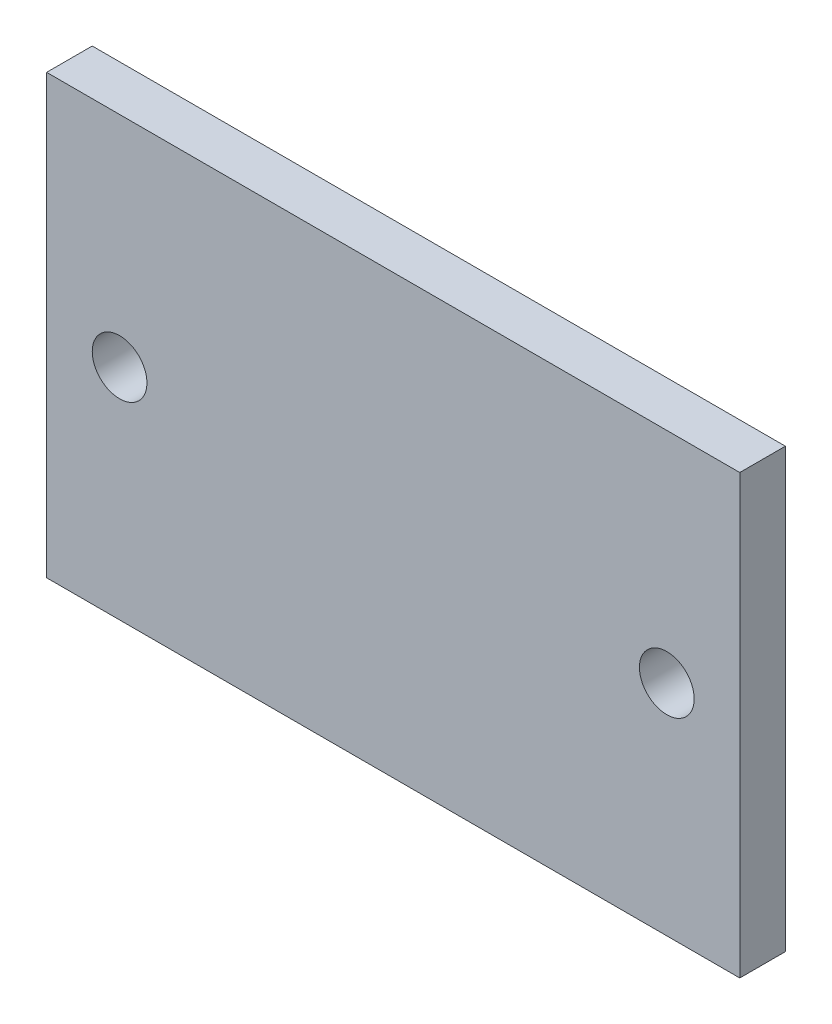
ISO-10303-21;
HEADER;
FILE_DESCRIPTION(('STEP AP214'),'2;1');
FILE_NAME('part.step','',(''),(''),'','','');
FILE_SCHEMA(('AUTOMOTIVE_DESIGN { 1 0 10303 214 1 1 1 1 }'));
ENDSEC;
DATA;
#1=APPLICATION_CONTEXT('core data for automotive mechanical design processes');
#2=APPLICATION_PROTOCOL_DEFINITION('international standard','automotive_design',2000,#1);
#3=PRODUCT_CONTEXT('',#1,'mechanical');
#4=PRODUCT('Part','Part','',(#3));
#5=PRODUCT_RELATED_PRODUCT_CATEGORY('part','',(#4));
#6=PRODUCT_DEFINITION_FORMATION('','',#4);
#7=PRODUCT_DEFINITION_CONTEXT('part definition',#1,'design');
#8=PRODUCT_DEFINITION('design','',#6,#7);
#9=PRODUCT_DEFINITION_SHAPE('','',#8);
#10=(LENGTH_UNIT() NAMED_UNIT(*) SI_UNIT(.MILLI.,.METRE.));
#11=(NAMED_UNIT(*) PLANE_ANGLE_UNIT() SI_UNIT($,.RADIAN.));
#12=(NAMED_UNIT(*) SI_UNIT($,.STERADIAN.) SOLID_ANGLE_UNIT());
#13=UNCERTAINTY_MEASURE_WITH_UNIT(LENGTH_MEASURE(1.E-05),#10,'distance_accuracy_value','');
#14=(GEOMETRIC_REPRESENTATION_CONTEXT(3) GLOBAL_UNCERTAINTY_ASSIGNED_CONTEXT((#13)) GLOBAL_UNIT_ASSIGNED_CONTEXT((#10,
#11,#12)) REPRESENTATION_CONTEXT('',''));
#15=CARTESIAN_POINT('',(0.,0.,0.));
#16=DIRECTION('',(0.,0.,1.));
#17=DIRECTION('',(1.,0.,0.));
#18=AXIS2_PLACEMENT_3D('',#15,#16,#17);
#19=CARTESIAN_POINT('',(0.,0.,3.175));
#20=DIRECTION('',(1.,0.,0.));
#21=DIRECTION('',(0.,0.,-1.));
#22=AXIS2_PLACEMENT_3D('',#19,#20,#21);
#23=PLANE('',#22);
#24=DIRECTION('',(0.,-1.,0.));
#25=VECTOR('',#24,1.);
#26=CARTESIAN_POINT('',(0.,0.,0.));
#27=LINE('',#26,#25);
#28=CARTESIAN_POINT('',(0.,30.48,0.));
#29=VERTEX_POINT('',#28);
#30=CARTESIAN_POINT('',(0.,0.,0.));
#31=VERTEX_POINT('',#30);
#32=EDGE_CURVE('E112',#29,#31,#27,.T.);
#33=ORIENTED_EDGE('',*,*,#32,.T.);
#34=DIRECTION('',(0.,0.,-1.));
#35=VECTOR('',#34,1.);
#36=CARTESIAN_POINT('',(0.,0.,3.175));
#37=LINE('',#36,#35);
#38=CARTESIAN_POINT('',(0.,0.,3.175));
#39=VERTEX_POINT('',#38);
#40=EDGE_CURVE('E11',#39,#31,#37,.T.);
#41=ORIENTED_EDGE('',*,*,#40,.F.);
#42=DIRECTION('',(0.,-1.,0.));
#43=VECTOR('',#42,1.);
#44=CARTESIAN_POINT('',(0.,0.,3.175));
#45=LINE('',#44,#43);
#46=CARTESIAN_POINT('',(0.,30.48,3.175));
#47=VERTEX_POINT('',#46);
#48=EDGE_CURVE('E96',#47,#39,#45,.T.);
#49=ORIENTED_EDGE('',*,*,#48,.F.);
#50=DIRECTION('',(0.,0.,-1.));
#51=VECTOR('',#50,1.);
#52=CARTESIAN_POINT('',(0.,30.48,3.175));
#53=LINE('',#52,#51);
#54=EDGE_CURVE('E108',#47,#29,#53,.T.);
#55=ORIENTED_EDGE('',*,*,#54,.T.);
#56=EDGE_LOOP('',(#33,#41,#49,#55));
#57=FACE_BOUND('',#56,.T.);
#58=ADVANCED_FACE('F44',(#57),#23,.F.);
#59=CARTESIAN_POINT('',(0.,0.,3.175));
#60=DIRECTION('',(0.,1.,0.));
#61=DIRECTION('',(0.,0.,1.));
#62=AXIS2_PLACEMENT_3D('',#59,#60,#61);
#63=PLANE('',#62);
#64=DIRECTION('',(1.,0.,0.));
#65=VECTOR('',#64,1.);
#66=CARTESIAN_POINT('',(0.,0.,0.));
#67=LINE('',#66,#65);
#68=CARTESIAN_POINT('',(48.26,0.,0.));
#69=VERTEX_POINT('',#68);
#70=EDGE_CURVE('E101',#31,#69,#67,.T.);
#71=ORIENTED_EDGE('',*,*,#70,.T.);
#72=DIRECTION('',(0.,0.,-1.));
#73=VECTOR('',#72,1.);
#74=CARTESIAN_POINT('',(48.26,0.,3.175));
#75=LINE('',#74,#73);
#76=CARTESIAN_POINT('',(48.26,0.,3.175));
#77=VERTEX_POINT('',#76);
#78=EDGE_CURVE('E53',#77,#69,#75,.T.);
#79=ORIENTED_EDGE('',*,*,#78,.F.);
#80=DIRECTION('',(1.,0.,0.));
#81=VECTOR('',#80,1.);
#82=CARTESIAN_POINT('',(0.,0.,3.175));
#83=LINE('',#82,#81);
#84=EDGE_CURVE('E91',#39,#77,#83,.T.);
#85=ORIENTED_EDGE('',*,*,#84,.F.);
#86=ORIENTED_EDGE('',*,*,#40,.T.);
#87=EDGE_LOOP('',(#71,#79,#85,#86));
#88=FACE_BOUND('',#87,.T.);
#89=ADVANCED_FACE('F100',(#88),#63,.F.);
#90=CARTESIAN_POINT('',(48.26,0.,3.175));
#91=DIRECTION('',(-1.,0.,0.));
#92=DIRECTION('',(0.,0.,1.));
#93=AXIS2_PLACEMENT_3D('',#90,#91,#92);
#94=PLANE('',#93);
#95=DIRECTION('',(0.,1.,0.));
#96=VECTOR('',#95,1.);
#97=CARTESIAN_POINT('',(48.26,0.,0.));
#98=LINE('',#97,#96);
#99=CARTESIAN_POINT('',(48.26,30.48,0.));
#100=VERTEX_POINT('',#99);
#101=EDGE_CURVE('E78',#69,#100,#98,.T.);
#102=ORIENTED_EDGE('',*,*,#101,.T.);
#103=DIRECTION('',(0.,0.,-1.));
#104=VECTOR('',#103,1.);
#105=CARTESIAN_POINT('',(48.26,30.48,3.175));
#106=LINE('',#105,#104);
#107=CARTESIAN_POINT('',(48.26,30.48,3.175));
#108=VERTEX_POINT('',#107);
#109=EDGE_CURVE('E103',#108,#100,#106,.T.);
#110=ORIENTED_EDGE('',*,*,#109,.F.);
#111=DIRECTION('',(0.,1.,0.));
#112=VECTOR('',#111,1.);
#113=CARTESIAN_POINT('',(48.26,0.,3.175));
#114=LINE('',#113,#112);
#115=EDGE_CURVE('E94',#77,#108,#114,.T.);
#116=ORIENTED_EDGE('',*,*,#115,.F.);
#117=ORIENTED_EDGE('',*,*,#78,.T.);
#118=EDGE_LOOP('',(#102,#110,#116,#117));
#119=FACE_BOUND('',#118,.T.);
#120=ADVANCED_FACE('F104',(#119),#94,.F.);
#121=CARTESIAN_POINT('',(0.,30.48,3.175));
#122=DIRECTION('',(0.,-1.,0.));
#123=DIRECTION('',(0.,0.,-1.));
#124=AXIS2_PLACEMENT_3D('',#121,#122,#123);
#125=PLANE('',#124);
#126=DIRECTION('',(-1.,0.,0.));
#127=VECTOR('',#126,1.);
#128=CARTESIAN_POINT('',(0.,30.48,0.));
#129=LINE('',#128,#127);
#130=EDGE_CURVE('E84',#100,#29,#129,.T.);
#131=ORIENTED_EDGE('',*,*,#130,.T.);
#132=ORIENTED_EDGE('',*,*,#54,.F.);
#133=DIRECTION('',(-1.,0.,0.));
#134=VECTOR('',#133,1.);
#135=CARTESIAN_POINT('',(0.,30.48,3.175));
#136=LINE('',#135,#134);
#137=EDGE_CURVE('E61',#108,#47,#136,.T.);
#138=ORIENTED_EDGE('',*,*,#137,.F.);
#139=ORIENTED_EDGE('',*,*,#109,.T.);
#140=EDGE_LOOP('',(#131,#132,#138,#139));
#141=FACE_BOUND('',#140,.T.);
#142=ADVANCED_FACE('F126',(#141),#125,.F.);
#143=CARTESIAN_POINT('',(0.,0.,3.175));
#144=DIRECTION('',(0.,0.,-1.));
#145=DIRECTION('',(-1.,0.,0.));
#146=AXIS2_PLACEMENT_3D('',#143,#144,#145);
#147=PLANE('',#146);
#148=CARTESIAN_POINT('',(5.08000000000008,15.2399999999999,3.175));
#149=DIRECTION('',(0.,0.,-1.));
#150=DIRECTION('',(-1.,0.,0.));
#151=AXIS2_PLACEMENT_3D('',#148,#149,#150);
#152=CIRCLE('',#151,1.905);
#153=CARTESIAN_POINT('',(3.17500000000008,15.2399999999999,3.175));
#154=VERTEX_POINT('',#153);
#155=EDGE_CURVE('E116',#154,#154,#152,.T.);
#156=ORIENTED_EDGE('',*,*,#155,.T.);
#157=EDGE_LOOP('',(#156));
#158=FACE_BOUND('',#157,.T.);
#159=CARTESIAN_POINT('',(43.1800000000001,15.2399999999999,3.175));
#160=DIRECTION('',(0.,0.,-1.));
#161=DIRECTION('',(-1.,0.,0.));
#162=AXIS2_PLACEMENT_3D('',#159,#160,#161);
#163=CIRCLE('',#162,1.905);
#164=CARTESIAN_POINT('',(41.2750000000001,15.2399999999999,3.175));
#165=VERTEX_POINT('',#164);
#166=EDGE_CURVE('E133',#165,#165,#163,.T.);
#167=ORIENTED_EDGE('',*,*,#166,.T.);
#168=EDGE_LOOP('',(#167));
#169=FACE_BOUND('',#168,.T.);
#170=ORIENTED_EDGE('',*,*,#48,.T.);
#171=ORIENTED_EDGE('',*,*,#84,.T.);
#172=ORIENTED_EDGE('',*,*,#115,.T.);
#173=ORIENTED_EDGE('',*,*,#137,.T.);
#174=EDGE_LOOP('',(#170,#171,#172,#173));
#175=FACE_BOUND('',#174,.T.);
#176=ADVANCED_FACE('F92',(#158,#169,#175),#147,.F.);
#177=CARTESIAN_POINT('',(0.,0.,0.));
#178=DIRECTION('',(0.,0.,-1.));
#179=DIRECTION('',(-1.,0.,0.));
#180=AXIS2_PLACEMENT_3D('',#177,#178,#179);
#181=PLANE('',#180);
#182=CARTESIAN_POINT('',(5.08000000000008,15.2399999999999,0.));
#183=DIRECTION('',(0.,0.,-1.));
#184=DIRECTION('',(-1.,0.,0.));
#185=AXIS2_PLACEMENT_3D('',#182,#183,#184);
#186=CIRCLE('',#185,1.905);
#187=CARTESIAN_POINT('',(3.17500000000008,15.2399999999999,0.));
#188=VERTEX_POINT('',#187);
#189=EDGE_CURVE('E141',#188,#188,#186,.T.);
#190=ORIENTED_EDGE('',*,*,#189,.F.);
#191=EDGE_LOOP('',(#190));
#192=FACE_BOUND('',#191,.T.);
#193=CARTESIAN_POINT('',(43.1800000000001,15.2399999999999,0.));
#194=DIRECTION('',(0.,0.,-1.));
#195=DIRECTION('',(-1.,0.,0.));
#196=AXIS2_PLACEMENT_3D('',#193,#194,#195);
#197=CIRCLE('',#196,1.905);
#198=CARTESIAN_POINT('',(41.2750000000001,15.2399999999999,0.));
#199=VERTEX_POINT('',#198);
#200=EDGE_CURVE('E137',#199,#199,#197,.T.);
#201=ORIENTED_EDGE('',*,*,#200,.F.);
#202=EDGE_LOOP('',(#201));
#203=FACE_BOUND('',#202,.T.);
#204=ORIENTED_EDGE('',*,*,#32,.F.);
#205=ORIENTED_EDGE('',*,*,#130,.F.);
#206=ORIENTED_EDGE('',*,*,#101,.F.);
#207=ORIENTED_EDGE('',*,*,#70,.F.);
#208=EDGE_LOOP('',(#204,#205,#206,#207));
#209=FACE_BOUND('',#208,.T.);
#210=ADVANCED_FACE('F129',(#192,#203,#209),#181,.T.);
#211=CARTESIAN_POINT('',(43.1800000000001,15.2399999999999,3.175));
#212=DIRECTION('',(0.,0.,-1.));
#213=DIRECTION('',(-1.,0.,0.));
#214=AXIS2_PLACEMENT_3D('',#211,#212,#213);
#215=CYLINDRICAL_SURFACE('',#214,1.905);
#216=ORIENTED_EDGE('',*,*,#166,.F.);
#217=EDGE_LOOP('',(#216));
#218=FACE_BOUND('',#217,.T.);
#219=ORIENTED_EDGE('',*,*,#200,.T.);
#220=EDGE_LOOP('',(#219));
#221=FACE_BOUND('',#220,.T.);
#222=ADVANCED_FACE('F154',(#218,#221),#215,.F.);
#223=CARTESIAN_POINT('',(5.08000000000008,15.2399999999999,3.175));
#224=DIRECTION('',(0.,0.,-1.));
#225=DIRECTION('',(-1.,0.,0.));
#226=AXIS2_PLACEMENT_3D('',#223,#224,#225);
#227=CYLINDRICAL_SURFACE('',#226,1.905);
#228=ORIENTED_EDGE('',*,*,#155,.F.);
#229=EDGE_LOOP('',(#228));
#230=FACE_BOUND('',#229,.T.);
#231=ORIENTED_EDGE('',*,*,#189,.T.);
#232=EDGE_LOOP('',(#231));
#233=FACE_BOUND('',#232,.T.);
#234=ADVANCED_FACE('F151',(#230,#233),#227,.F.);
#235=CLOSED_SHELL('',(#58,#89,#120,#142,#176,#210,#222,#234));
#236=MANIFOLD_SOLID_BREP('B2',#235);
#237=ADVANCED_BREP_SHAPE_REPRESENTATION('',(#18,#236),#14);
#238=SHAPE_DEFINITION_REPRESENTATION(#9,#237);
ENDSEC;
END-ISO-10303-21;
